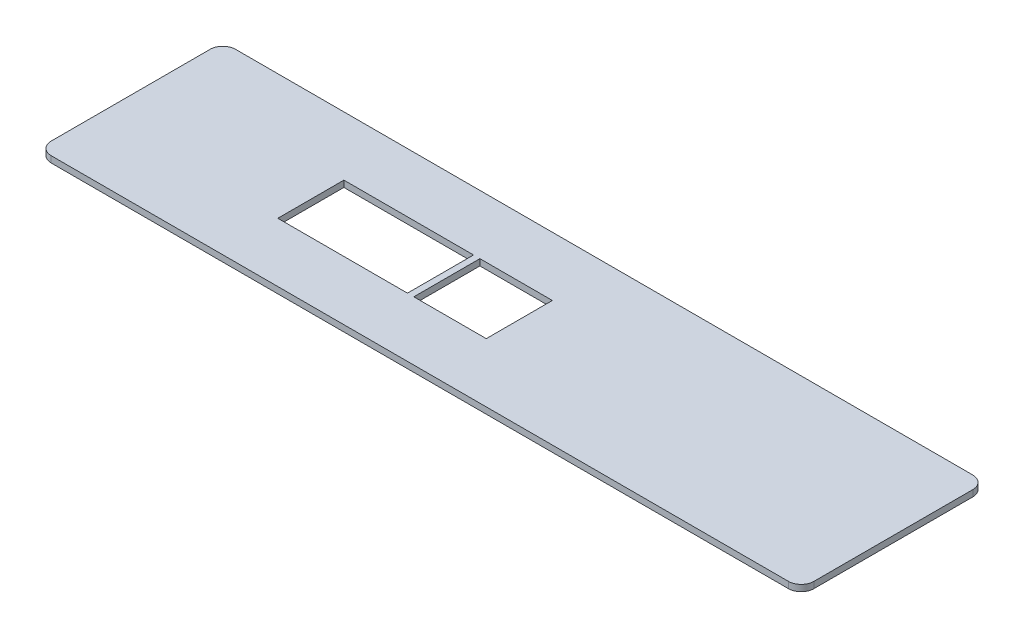
ISO-10303-21;
HEADER;
FILE_DESCRIPTION(('STEP AP214'),'2;1');
FILE_NAME('part.step','',(''),(''),'','','');
FILE_SCHEMA(('AUTOMOTIVE_DESIGN { 1 0 10303 214 1 1 1 1 }'));
ENDSEC;
DATA;
#1=APPLICATION_CONTEXT('core data for automotive mechanical design processes');
#2=APPLICATION_PROTOCOL_DEFINITION('international standard','automotive_design',2000,#1);
#3=PRODUCT_CONTEXT('',#1,'mechanical');
#4=PRODUCT('Part','Part','',(#3));
#5=PRODUCT_RELATED_PRODUCT_CATEGORY('part','',(#4));
#6=PRODUCT_DEFINITION_FORMATION('','',#4);
#7=PRODUCT_DEFINITION_CONTEXT('part definition',#1,'design');
#8=PRODUCT_DEFINITION('design','',#6,#7);
#9=PRODUCT_DEFINITION_SHAPE('','',#8);
#10=(LENGTH_UNIT() NAMED_UNIT(*) SI_UNIT(.MILLI.,.METRE.));
#11=(NAMED_UNIT(*) PLANE_ANGLE_UNIT() SI_UNIT($,.RADIAN.));
#12=(NAMED_UNIT(*) SI_UNIT($,.STERADIAN.) SOLID_ANGLE_UNIT());
#13=UNCERTAINTY_MEASURE_WITH_UNIT(LENGTH_MEASURE(1.E-05),#10,'distance_accuracy_value','');
#14=(GEOMETRIC_REPRESENTATION_CONTEXT(3) GLOBAL_UNCERTAINTY_ASSIGNED_CONTEXT((#13)) GLOBAL_UNIT_ASSIGNED_CONTEXT((#10,
#11,#12)) REPRESENTATION_CONTEXT('',''));
#15=CARTESIAN_POINT('',(0.,0.,0.));
#16=DIRECTION('',(0.,0.,1.));
#17=DIRECTION('',(1.,0.,0.));
#18=AXIS2_PLACEMENT_3D('',#15,#16,#17);
#19=CARTESIAN_POINT('',(118.,1.,-12.5));
#20=DIRECTION('',(0.,-1.,0.));
#21=DIRECTION('',(0.,0.,-1.));
#22=AXIS2_PLACEMENT_3D('',#19,#20,#21);
#23=PLANE('',#22);
#24=DIRECTION('',(0.,0.,1.));
#25=VECTOR('',#24,1.);
#26=CARTESIAN_POINT('',(28.35,1.,-5.2));
#27=LINE('',#26,#25);
#28=CARTESIAN_POINT('',(28.35,1.,-5.2));
#29=VERTEX_POINT('',#28);
#30=CARTESIAN_POINT('',(28.35,1.,5.2));
#31=VERTEX_POINT('',#30);
#32=EDGE_CURVE('E192',#29,#31,#27,.T.);
#33=ORIENTED_EDGE('',*,*,#32,.F.);
#34=DIRECTION('',(-1.,0.,0.));
#35=VECTOR('',#34,1.);
#36=CARTESIAN_POINT('',(28.35,1.,-5.2));
#37=LINE('',#36,#35);
#38=CARTESIAN_POINT('',(48.75,1.,-5.2));
#39=VERTEX_POINT('',#38);
#40=EDGE_CURVE('E200',#39,#29,#37,.T.);
#41=ORIENTED_EDGE('',*,*,#40,.F.);
#42=DIRECTION('',(0.,0.,-1.));
#43=VECTOR('',#42,1.);
#44=CARTESIAN_POINT('',(48.75,1.,-5.2));
#45=LINE('',#44,#43);
#46=CARTESIAN_POINT('',(48.75,1.,5.2));
#47=VERTEX_POINT('',#46);
#48=EDGE_CURVE('E197',#47,#39,#45,.T.);
#49=ORIENTED_EDGE('',*,*,#48,.F.);
#50=DIRECTION('',(1.,0.,0.));
#51=VECTOR('',#50,1.);
#52=CARTESIAN_POINT('',(28.35,1.,5.2));
#53=LINE('',#52,#51);
#54=EDGE_CURVE('E194',#31,#47,#53,.T.);
#55=ORIENTED_EDGE('',*,*,#54,.F.);
#56=EDGE_LOOP('',(#33,#41,#49,#55));
#57=FACE_BOUND('',#56,.T.);
#58=CARTESIAN_POINT('',(118.,1.,-12.5));
#59=DIRECTION('',(0.,1.,0.));
#60=DIRECTION('',(0.,0.,-1.));
#61=AXIS2_PLACEMENT_3D('',#58,#59,#60);
#62=CIRCLE('',#61,2.);
#63=CARTESIAN_POINT('',(120.,1.,-12.5));
#64=VERTEX_POINT('',#63);
#65=CARTESIAN_POINT('',(118.,1.,-14.5));
#66=VERTEX_POINT('',#65);
#67=EDGE_CURVE('E223',#64,#66,#62,.T.);
#68=ORIENTED_EDGE('',*,*,#67,.T.);
#69=DIRECTION('',(-1.,0.,0.));
#70=VECTOR('',#69,1.);
#71=CARTESIAN_POINT('',(118.,1.,-14.5));
#72=LINE('',#71,#70);
#73=CARTESIAN_POINT('',(2.00000000000001,1.,-14.5));
#74=VERTEX_POINT('',#73);
#75=EDGE_CURVE('E226',#66,#74,#72,.T.);
#76=ORIENTED_EDGE('',*,*,#75,.T.);
#77=CARTESIAN_POINT('',(1.99999999999999,1.,-12.5));
#78=DIRECTION('',(0.,1.,0.));
#79=DIRECTION('',(0.,0.,1.));
#80=AXIS2_PLACEMENT_3D('',#77,#78,#79);
#81=CIRCLE('',#80,2.);
#82=CARTESIAN_POINT('',(0.,1.,-12.5));
#83=VERTEX_POINT('',#82);
#84=EDGE_CURVE('E229',#74,#83,#81,.T.);
#85=ORIENTED_EDGE('',*,*,#84,.T.);
#86=DIRECTION('',(0.,0.,1.));
#87=VECTOR('',#86,1.);
#88=CARTESIAN_POINT('',(0.,1.,-12.5));
#89=LINE('',#88,#87);
#90=CARTESIAN_POINT('',(0.,1.,12.5));
#91=VERTEX_POINT('',#90);
#92=EDGE_CURVE('E231',#83,#91,#89,.T.);
#93=ORIENTED_EDGE('',*,*,#92,.T.);
#94=CARTESIAN_POINT('',(2.,1.,12.5));
#95=DIRECTION('',(0.,1.,0.));
#96=DIRECTION('',(0.,0.,-1.));
#97=AXIS2_PLACEMENT_3D('',#94,#95,#96);
#98=CIRCLE('',#97,2.);
#99=CARTESIAN_POINT('',(2.00000000000001,1.,14.5));
#100=VERTEX_POINT('',#99);
#101=EDGE_CURVE('E233',#91,#100,#98,.T.);
#102=ORIENTED_EDGE('',*,*,#101,.T.);
#103=DIRECTION('',(1.,0.,0.));
#104=VECTOR('',#103,1.);
#105=CARTESIAN_POINT('',(2.00000000000001,1.,14.5));
#106=LINE('',#105,#104);
#107=CARTESIAN_POINT('',(118.,1.,14.4999999999999));
#108=VERTEX_POINT('',#107);
#109=EDGE_CURVE('E235',#100,#108,#106,.T.);
#110=ORIENTED_EDGE('',*,*,#109,.T.);
#111=CARTESIAN_POINT('',(118.,1.,12.4999999999999));
#112=DIRECTION('',(0.,1.,0.));
#113=DIRECTION('',(0.,0.,-1.));
#114=AXIS2_PLACEMENT_3D('',#111,#112,#113);
#115=CIRCLE('',#114,2.);
#116=CARTESIAN_POINT('',(120.,1.,12.4999999999999));
#117=VERTEX_POINT('',#116);
#118=EDGE_CURVE('E237',#108,#117,#115,.T.);
#119=ORIENTED_EDGE('',*,*,#118,.T.);
#120=DIRECTION('',(0.,0.,-1.));
#121=VECTOR('',#120,1.);
#122=CARTESIAN_POINT('',(120.,1.,12.4999999999999));
#123=LINE('',#122,#121);
#124=EDGE_CURVE('E239',#117,#64,#123,.T.);
#125=ORIENTED_EDGE('',*,*,#124,.T.);
#126=EDGE_LOOP('',(#68,#76,#85,#93,#102,#110,#119,#125));
#127=FACE_BOUND('',#126,.T.);
#128=DIRECTION('',(0.,0.,1.));
#129=VECTOR('',#128,1.);
#130=CARTESIAN_POINT('',(49.75,1.,-5.2));
#131=LINE('',#130,#129);
#132=CARTESIAN_POINT('',(49.75,1.,-5.2));
#133=VERTEX_POINT('',#132);
#134=CARTESIAN_POINT('',(49.75,1.,5.2));
#135=VERTEX_POINT('',#134);
#136=EDGE_CURVE('E156',#133,#135,#131,.T.);
#137=ORIENTED_EDGE('',*,*,#136,.F.);
#138=DIRECTION('',(-1.,0.,0.));
#139=VECTOR('',#138,1.);
#140=CARTESIAN_POINT('',(49.75,1.,-5.2));
#141=LINE('',#140,#139);
#142=CARTESIAN_POINT('',(61.15,1.,-5.2));
#143=VERTEX_POINT('',#142);
#144=EDGE_CURVE('E178',#143,#133,#141,.T.);
#145=ORIENTED_EDGE('',*,*,#144,.F.);
#146=DIRECTION('',(0.,0.,-1.));
#147=VECTOR('',#146,1.);
#148=CARTESIAN_POINT('',(61.15,1.,-5.2));
#149=LINE('',#148,#147);
#150=CARTESIAN_POINT('',(61.15,1.,5.2));
#151=VERTEX_POINT('',#150);
#152=EDGE_CURVE('E176',#151,#143,#149,.T.);
#153=ORIENTED_EDGE('',*,*,#152,.F.);
#154=DIRECTION('',(1.,0.,0.));
#155=VECTOR('',#154,1.);
#156=CARTESIAN_POINT('',(49.75,1.,5.2));
#157=LINE('',#156,#155);
#158=EDGE_CURVE('E164',#135,#151,#157,.T.);
#159=ORIENTED_EDGE('',*,*,#158,.F.);
#160=EDGE_LOOP('',(#137,#145,#153,#159));
#161=FACE_BOUND('',#160,.T.);
#162=ADVANCED_FACE('F43',(#57,#127,#161),#23,.F.);
#163=CARTESIAN_POINT('',(118.,0.,-12.5));
#164=DIRECTION('',(0.,-1.,0.));
#165=DIRECTION('',(0.,0.,-1.));
#166=AXIS2_PLACEMENT_3D('',#163,#164,#165);
#167=PLANE('',#166);
#168=CARTESIAN_POINT('',(118.,0.,-12.5));
#169=DIRECTION('',(0.,1.,0.));
#170=DIRECTION('',(0.,0.,-1.));
#171=AXIS2_PLACEMENT_3D('',#168,#169,#170);
#172=CIRCLE('',#171,2.);
#173=CARTESIAN_POINT('',(120.,0.,-12.5));
#174=VERTEX_POINT('',#173);
#175=CARTESIAN_POINT('',(118.,0.,-14.5));
#176=VERTEX_POINT('',#175);
#177=EDGE_CURVE('E222',#174,#176,#172,.T.);
#178=ORIENTED_EDGE('',*,*,#177,.F.);
#179=DIRECTION('',(0.,0.,-1.));
#180=VECTOR('',#179,1.);
#181=CARTESIAN_POINT('',(120.,0.,12.4999999999999));
#182=LINE('',#181,#180);
#183=CARTESIAN_POINT('',(120.,0.,12.4999999999999));
#184=VERTEX_POINT('',#183);
#185=EDGE_CURVE('E227',#184,#174,#182,.T.);
#186=ORIENTED_EDGE('',*,*,#185,.F.);
#187=CARTESIAN_POINT('',(118.,0.,12.4999999999999));
#188=DIRECTION('',(0.,1.,0.));
#189=DIRECTION('',(0.,0.,-1.));
#190=AXIS2_PLACEMENT_3D('',#187,#188,#189);
#191=CIRCLE('',#190,2.);
#192=CARTESIAN_POINT('',(118.,0.,14.4999999999999));
#193=VERTEX_POINT('',#192);
#194=EDGE_CURVE('E254',#193,#184,#191,.T.);
#195=ORIENTED_EDGE('',*,*,#194,.F.);
#196=DIRECTION('',(1.,0.,0.));
#197=VECTOR('',#196,1.);
#198=CARTESIAN_POINT('',(2.00000000000001,0.,14.5));
#199=LINE('',#198,#197);
#200=CARTESIAN_POINT('',(2.00000000000001,0.,14.5));
#201=VERTEX_POINT('',#200);
#202=EDGE_CURVE('E252',#201,#193,#199,.T.);
#203=ORIENTED_EDGE('',*,*,#202,.F.);
#204=CARTESIAN_POINT('',(2.,0.,12.5));
#205=DIRECTION('',(0.,1.,0.));
#206=DIRECTION('',(0.,0.,-1.));
#207=AXIS2_PLACEMENT_3D('',#204,#205,#206);
#208=CIRCLE('',#207,2.);
#209=CARTESIAN_POINT('',(0.,0.,12.5));
#210=VERTEX_POINT('',#209);
#211=EDGE_CURVE('E250',#210,#201,#208,.T.);
#212=ORIENTED_EDGE('',*,*,#211,.F.);
#213=DIRECTION('',(0.,0.,1.));
#214=VECTOR('',#213,1.);
#215=CARTESIAN_POINT('',(0.,0.,-12.5));
#216=LINE('',#215,#214);
#217=CARTESIAN_POINT('',(0.,0.,-12.5));
#218=VERTEX_POINT('',#217);
#219=EDGE_CURVE('E248',#218,#210,#216,.T.);
#220=ORIENTED_EDGE('',*,*,#219,.F.);
#221=CARTESIAN_POINT('',(1.99999999999999,0.,-12.5));
#222=DIRECTION('',(0.,1.,0.));
#223=DIRECTION('',(0.,0.,1.));
#224=AXIS2_PLACEMENT_3D('',#221,#222,#223);
#225=CIRCLE('',#224,2.);
#226=CARTESIAN_POINT('',(2.00000000000001,0.,-14.5));
#227=VERTEX_POINT('',#226);
#228=EDGE_CURVE('E246',#227,#218,#225,.T.);
#229=ORIENTED_EDGE('',*,*,#228,.F.);
#230=DIRECTION('',(-1.,0.,0.));
#231=VECTOR('',#230,1.);
#232=CARTESIAN_POINT('',(118.,0.,-14.5));
#233=LINE('',#232,#231);
#234=EDGE_CURVE('E244',#176,#227,#233,.T.);
#235=ORIENTED_EDGE('',*,*,#234,.F.);
#236=EDGE_LOOP('',(#178,#186,#195,#203,#212,#220,#229,#235));
#237=FACE_BOUND('',#236,.T.);
#238=DIRECTION('',(-1.,0.,0.));
#239=VECTOR('',#238,1.);
#240=CARTESIAN_POINT('',(28.35,0.,-5.2));
#241=LINE('',#240,#239);
#242=CARTESIAN_POINT('',(48.75,0.,-5.2));
#243=VERTEX_POINT('',#242);
#244=CARTESIAN_POINT('',(28.35,0.,-5.2));
#245=VERTEX_POINT('',#244);
#246=EDGE_CURVE('E195',#243,#245,#241,.T.);
#247=ORIENTED_EDGE('',*,*,#246,.T.);
#248=DIRECTION('',(0.,0.,1.));
#249=VECTOR('',#248,1.);
#250=CARTESIAN_POINT('',(28.35,0.,-5.2));
#251=LINE('',#250,#249);
#252=CARTESIAN_POINT('',(28.35,0.,5.2));
#253=VERTEX_POINT('',#252);
#254=EDGE_CURVE('E172',#245,#253,#251,.T.);
#255=ORIENTED_EDGE('',*,*,#254,.T.);
#256=DIRECTION('',(1.,0.,0.));
#257=VECTOR('',#256,1.);
#258=CARTESIAN_POINT('',(28.35,0.,5.2));
#259=LINE('',#258,#257);
#260=CARTESIAN_POINT('',(48.75,0.,5.2));
#261=VERTEX_POINT('',#260);
#262=EDGE_CURVE('E205',#253,#261,#259,.T.);
#263=ORIENTED_EDGE('',*,*,#262,.T.);
#264=DIRECTION('',(0.,0.,-1.));
#265=VECTOR('',#264,1.);
#266=CARTESIAN_POINT('',(48.75,0.,-5.2));
#267=LINE('',#266,#265);
#268=EDGE_CURVE('E208',#261,#243,#267,.T.);
#269=ORIENTED_EDGE('',*,*,#268,.T.);
#270=EDGE_LOOP('',(#247,#255,#263,#269));
#271=FACE_BOUND('',#270,.T.);
#272=DIRECTION('',(-1.,0.,0.));
#273=VECTOR('',#272,1.);
#274=CARTESIAN_POINT('',(49.75,0.,-5.2));
#275=LINE('',#274,#273);
#276=CARTESIAN_POINT('',(61.15,0.,-5.2));
#277=VERTEX_POINT('',#276);
#278=CARTESIAN_POINT('',(49.75,0.,-5.2));
#279=VERTEX_POINT('',#278);
#280=EDGE_CURVE('E165',#277,#279,#275,.T.);
#281=ORIENTED_EDGE('',*,*,#280,.T.);
#282=DIRECTION('',(0.,0.,1.));
#283=VECTOR('',#282,1.);
#284=CARTESIAN_POINT('',(49.75,0.,-5.2));
#285=LINE('',#284,#283);
#286=CARTESIAN_POINT('',(49.75,0.,5.2));
#287=VERTEX_POINT('',#286);
#288=EDGE_CURVE('E66',#279,#287,#285,.T.);
#289=ORIENTED_EDGE('',*,*,#288,.T.);
#290=DIRECTION('',(1.,0.,0.));
#291=VECTOR('',#290,1.);
#292=CARTESIAN_POINT('',(49.75,0.,5.2));
#293=LINE('',#292,#291);
#294=CARTESIAN_POINT('',(61.15,0.,5.2));
#295=VERTEX_POINT('',#294);
#296=EDGE_CURVE('E171',#287,#295,#293,.T.);
#297=ORIENTED_EDGE('',*,*,#296,.T.);
#298=DIRECTION('',(0.,0.,-1.));
#299=VECTOR('',#298,1.);
#300=CARTESIAN_POINT('',(61.15,0.,-5.2));
#301=LINE('',#300,#299);
#302=EDGE_CURVE('E184',#295,#277,#301,.T.);
#303=ORIENTED_EDGE('',*,*,#302,.T.);
#304=EDGE_LOOP('',(#281,#289,#297,#303));
#305=FACE_BOUND('',#304,.T.);
#306=ADVANCED_FACE('F284',(#237,#271,#305),#167,.T.);
#307=CARTESIAN_POINT('',(118.,1.,-12.5));
#308=DIRECTION('',(0.,-1.,0.));
#309=DIRECTION('',(0.,0.,-1.));
#310=AXIS2_PLACEMENT_3D('',#307,#308,#309);
#311=CYLINDRICAL_SURFACE('',#310,2.);
#312=ORIENTED_EDGE('',*,*,#177,.T.);
#313=DIRECTION('',(0.,-1.,0.));
#314=VECTOR('',#313,1.);
#315=CARTESIAN_POINT('',(118.,1.,-14.5));
#316=LINE('',#315,#314);
#317=EDGE_CURVE('E11',#66,#176,#316,.T.);
#318=ORIENTED_EDGE('',*,*,#317,.F.);
#319=ORIENTED_EDGE('',*,*,#67,.F.);
#320=DIRECTION('',(0.,-1.,0.));
#321=VECTOR('',#320,1.);
#322=CARTESIAN_POINT('',(120.,1.,-12.5));
#323=LINE('',#322,#321);
#324=EDGE_CURVE('E241',#64,#174,#323,.T.);
#325=ORIENTED_EDGE('',*,*,#324,.T.);
#326=EDGE_LOOP('',(#312,#318,#319,#325));
#327=FACE_BOUND('',#326,.T.);
#328=ADVANCED_FACE('F45',(#327),#311,.T.);
#329=CARTESIAN_POINT('',(118.,1.,-14.5));
#330=DIRECTION('',(0.,0.,1.));
#331=DIRECTION('',(1.,0.,0.));
#332=AXIS2_PLACEMENT_3D('',#329,#330,#331);
#333=PLANE('',#332);
#334=ORIENTED_EDGE('',*,*,#234,.T.);
#335=DIRECTION('',(0.,-1.,0.));
#336=VECTOR('',#335,1.);
#337=CARTESIAN_POINT('',(2.00000000000001,1.,-14.5));
#338=LINE('',#337,#336);
#339=EDGE_CURVE('E51',#74,#227,#338,.T.);
#340=ORIENTED_EDGE('',*,*,#339,.F.);
#341=ORIENTED_EDGE('',*,*,#75,.F.);
#342=ORIENTED_EDGE('',*,*,#317,.T.);
#343=EDGE_LOOP('',(#334,#340,#341,#342));
#344=FACE_BOUND('',#343,.T.);
#345=ADVANCED_FACE('F301',(#344),#333,.F.);
#346=CARTESIAN_POINT('',(1.99999999999999,1.,-12.5));
#347=DIRECTION('',(0.,-1.,0.));
#348=DIRECTION('',(0.,0.,-1.));
#349=AXIS2_PLACEMENT_3D('',#346,#347,#348);
#350=CYLINDRICAL_SURFACE('',#349,2.);
#351=ORIENTED_EDGE('',*,*,#228,.T.);
#352=DIRECTION('',(0.,-1.,0.));
#353=VECTOR('',#352,1.);
#354=CARTESIAN_POINT('',(0.,1.,-12.5));
#355=LINE('',#354,#353);
#356=EDGE_CURVE('E271',#83,#218,#355,.T.);
#357=ORIENTED_EDGE('',*,*,#356,.F.);
#358=ORIENTED_EDGE('',*,*,#84,.F.);
#359=ORIENTED_EDGE('',*,*,#339,.T.);
#360=EDGE_LOOP('',(#351,#357,#358,#359));
#361=FACE_BOUND('',#360,.T.);
#362=ADVANCED_FACE('F278',(#361),#350,.T.);
#363=CARTESIAN_POINT('',(0.,1.,-12.5));
#364=DIRECTION('',(1.,0.,0.));
#365=DIRECTION('',(0.,0.,-1.));
#366=AXIS2_PLACEMENT_3D('',#363,#364,#365);
#367=PLANE('',#366);
#368=ORIENTED_EDGE('',*,*,#219,.T.);
#369=DIRECTION('',(0.,-1.,0.));
#370=VECTOR('',#369,1.);
#371=CARTESIAN_POINT('',(0.,1.,12.5));
#372=LINE('',#371,#370);
#373=EDGE_CURVE('E268',#91,#210,#372,.T.);
#374=ORIENTED_EDGE('',*,*,#373,.F.);
#375=ORIENTED_EDGE('',*,*,#92,.F.);
#376=ORIENTED_EDGE('',*,*,#356,.T.);
#377=EDGE_LOOP('',(#368,#374,#375,#376));
#378=FACE_BOUND('',#377,.T.);
#379=ADVANCED_FACE('F290',(#378),#367,.F.);
#380=CARTESIAN_POINT('',(2.,1.,12.5));
#381=DIRECTION('',(0.,-1.,0.));
#382=DIRECTION('',(0.,0.,-1.));
#383=AXIS2_PLACEMENT_3D('',#380,#381,#382);
#384=CYLINDRICAL_SURFACE('',#383,2.);
#385=ORIENTED_EDGE('',*,*,#211,.T.);
#386=DIRECTION('',(0.,-1.,0.));
#387=VECTOR('',#386,1.);
#388=CARTESIAN_POINT('',(2.00000000000001,1.,14.5));
#389=LINE('',#388,#387);
#390=EDGE_CURVE('E265',#100,#201,#389,.T.);
#391=ORIENTED_EDGE('',*,*,#390,.F.);
#392=ORIENTED_EDGE('',*,*,#101,.F.);
#393=ORIENTED_EDGE('',*,*,#373,.T.);
#394=EDGE_LOOP('',(#385,#391,#392,#393));
#395=FACE_BOUND('',#394,.T.);
#396=ADVANCED_FACE('F294',(#395),#384,.T.);
#397=CARTESIAN_POINT('',(2.00000000000001,1.,14.5));
#398=DIRECTION('',(0.,0.,-1.));
#399=DIRECTION('',(-1.,0.,0.));
#400=AXIS2_PLACEMENT_3D('',#397,#398,#399);
#401=PLANE('',#400);
#402=ORIENTED_EDGE('',*,*,#202,.T.);
#403=DIRECTION('',(0.,-1.,0.));
#404=VECTOR('',#403,1.);
#405=CARTESIAN_POINT('',(118.,1.,14.4999999999999));
#406=LINE('',#405,#404);
#407=EDGE_CURVE('E262',#108,#193,#406,.T.);
#408=ORIENTED_EDGE('',*,*,#407,.F.);
#409=ORIENTED_EDGE('',*,*,#109,.F.);
#410=ORIENTED_EDGE('',*,*,#390,.T.);
#411=EDGE_LOOP('',(#402,#408,#409,#410));
#412=FACE_BOUND('',#411,.T.);
#413=ADVANCED_FACE('F314',(#412),#401,.F.);
#414=CARTESIAN_POINT('',(118.,1.,12.4999999999999));
#415=DIRECTION('',(0.,-1.,0.));
#416=DIRECTION('',(0.,0.,-1.));
#417=AXIS2_PLACEMENT_3D('',#414,#415,#416);
#418=CYLINDRICAL_SURFACE('',#417,2.);
#419=ORIENTED_EDGE('',*,*,#194,.T.);
#420=DIRECTION('',(0.,-1.,0.));
#421=VECTOR('',#420,1.);
#422=CARTESIAN_POINT('',(120.,1.,12.4999999999999));
#423=LINE('',#422,#421);
#424=EDGE_CURVE('E259',#117,#184,#423,.T.);
#425=ORIENTED_EDGE('',*,*,#424,.F.);
#426=ORIENTED_EDGE('',*,*,#118,.F.);
#427=ORIENTED_EDGE('',*,*,#407,.T.);
#428=EDGE_LOOP('',(#419,#425,#426,#427));
#429=FACE_BOUND('',#428,.T.);
#430=ADVANCED_FACE('F312',(#429),#418,.T.);
#431=CARTESIAN_POINT('',(120.,1.,12.4999999999999));
#432=DIRECTION('',(-1.,0.,0.));
#433=DIRECTION('',(0.,0.,1.));
#434=AXIS2_PLACEMENT_3D('',#431,#432,#433);
#435=PLANE('',#434);
#436=ORIENTED_EDGE('',*,*,#185,.T.);
#437=ORIENTED_EDGE('',*,*,#324,.F.);
#438=ORIENTED_EDGE('',*,*,#124,.F.);
#439=ORIENTED_EDGE('',*,*,#424,.T.);
#440=EDGE_LOOP('',(#436,#437,#438,#439));
#441=FACE_BOUND('',#440,.T.);
#442=ADVANCED_FACE('F307',(#441),#435,.F.);
#443=CARTESIAN_POINT('',(28.35,1.,-5.2));
#444=DIRECTION('',(1.,0.,0.));
#445=DIRECTION('',(0.,0.,-1.));
#446=AXIS2_PLACEMENT_3D('',#443,#444,#445);
#447=PLANE('',#446);
#448=ORIENTED_EDGE('',*,*,#254,.F.);
#449=DIRECTION('',(0.,-1.,0.));
#450=VECTOR('',#449,1.);
#451=CARTESIAN_POINT('',(28.35,1.,-5.2));
#452=LINE('',#451,#450);
#453=EDGE_CURVE('E202',#29,#245,#452,.T.);
#454=ORIENTED_EDGE('',*,*,#453,.F.);
#455=ORIENTED_EDGE('',*,*,#32,.T.);
#456=DIRECTION('',(0.,-1.,0.));
#457=VECTOR('',#456,1.);
#458=CARTESIAN_POINT('',(28.35,1.,5.2));
#459=LINE('',#458,#457);
#460=EDGE_CURVE('E219',#31,#253,#459,.T.);
#461=ORIENTED_EDGE('',*,*,#460,.T.);
#462=EDGE_LOOP('',(#448,#454,#455,#461));
#463=FACE_BOUND('',#462,.T.);
#464=ADVANCED_FACE('F332',(#463),#447,.T.);
#465=CARTESIAN_POINT('',(28.35,1.,5.2));
#466=DIRECTION('',(0.,0.,-1.));
#467=DIRECTION('',(-1.,0.,0.));
#468=AXIS2_PLACEMENT_3D('',#465,#466,#467);
#469=PLANE('',#468);
#470=ORIENTED_EDGE('',*,*,#262,.F.);
#471=ORIENTED_EDGE('',*,*,#460,.F.);
#472=ORIENTED_EDGE('',*,*,#54,.T.);
#473=DIRECTION('',(0.,-1.,0.));
#474=VECTOR('',#473,1.);
#475=CARTESIAN_POINT('',(48.75,1.,5.2));
#476=LINE('',#475,#474);
#477=EDGE_CURVE('E217',#47,#261,#476,.T.);
#478=ORIENTED_EDGE('',*,*,#477,.T.);
#479=EDGE_LOOP('',(#470,#471,#472,#478));
#480=FACE_BOUND('',#479,.T.);
#481=ADVANCED_FACE('F339',(#480),#469,.T.);
#482=CARTESIAN_POINT('',(48.75,1.,-5.2));
#483=DIRECTION('',(-1.,0.,0.));
#484=DIRECTION('',(0.,0.,1.));
#485=AXIS2_PLACEMENT_3D('',#482,#483,#484);
#486=PLANE('',#485);
#487=ORIENTED_EDGE('',*,*,#268,.F.);
#488=ORIENTED_EDGE('',*,*,#477,.F.);
#489=ORIENTED_EDGE('',*,*,#48,.T.);
#490=DIRECTION('',(0.,-1.,0.));
#491=VECTOR('',#490,1.);
#492=CARTESIAN_POINT('',(48.75,1.,-5.2));
#493=LINE('',#492,#491);
#494=EDGE_CURVE('E215',#39,#243,#493,.T.);
#495=ORIENTED_EDGE('',*,*,#494,.T.);
#496=EDGE_LOOP('',(#487,#488,#489,#495));
#497=FACE_BOUND('',#496,.T.);
#498=ADVANCED_FACE('F344',(#497),#486,.T.);
#499=CARTESIAN_POINT('',(28.35,1.,-5.2));
#500=DIRECTION('',(0.,0.,1.));
#501=DIRECTION('',(1.,0.,0.));
#502=AXIS2_PLACEMENT_3D('',#499,#500,#501);
#503=PLANE('',#502);
#504=ORIENTED_EDGE('',*,*,#246,.F.);
#505=ORIENTED_EDGE('',*,*,#494,.F.);
#506=ORIENTED_EDGE('',*,*,#40,.T.);
#507=ORIENTED_EDGE('',*,*,#453,.T.);
#508=EDGE_LOOP('',(#504,#505,#506,#507));
#509=FACE_BOUND('',#508,.T.);
#510=ADVANCED_FACE('F350',(#509),#503,.T.);
#511=CARTESIAN_POINT('',(49.75,1.,-5.2));
#512=DIRECTION('',(1.,0.,0.));
#513=DIRECTION('',(0.,0.,-1.));
#514=AXIS2_PLACEMENT_3D('',#511,#512,#513);
#515=PLANE('',#514);
#516=ORIENTED_EDGE('',*,*,#288,.F.);
#517=DIRECTION('',(0.,-1.,0.));
#518=VECTOR('',#517,1.);
#519=CARTESIAN_POINT('',(49.75,1.,-5.2));
#520=LINE('',#519,#518);
#521=EDGE_CURVE('E160',#133,#279,#520,.T.);
#522=ORIENTED_EDGE('',*,*,#521,.F.);
#523=ORIENTED_EDGE('',*,*,#136,.T.);
#524=DIRECTION('',(0.,-1.,0.));
#525=VECTOR('',#524,1.);
#526=CARTESIAN_POINT('',(49.75,1.,5.2));
#527=LINE('',#526,#525);
#528=EDGE_CURVE('E159',#135,#287,#527,.T.);
#529=ORIENTED_EDGE('',*,*,#528,.T.);
#530=EDGE_LOOP('',(#516,#522,#523,#529));
#531=FACE_BOUND('',#530,.T.);
#532=ADVANCED_FACE('F158',(#531),#515,.T.);
#533=CARTESIAN_POINT('',(49.75,1.,5.2));
#534=DIRECTION('',(0.,0.,-1.));
#535=DIRECTION('',(-1.,0.,0.));
#536=AXIS2_PLACEMENT_3D('',#533,#534,#535);
#537=PLANE('',#536);
#538=ORIENTED_EDGE('',*,*,#296,.F.);
#539=ORIENTED_EDGE('',*,*,#528,.F.);
#540=ORIENTED_EDGE('',*,*,#158,.T.);
#541=DIRECTION('',(0.,-1.,0.));
#542=VECTOR('',#541,1.);
#543=CARTESIAN_POINT('',(61.15,1.,5.2));
#544=LINE('',#543,#542);
#545=EDGE_CURVE('E173',#151,#295,#544,.T.);
#546=ORIENTED_EDGE('',*,*,#545,.T.);
#547=EDGE_LOOP('',(#538,#539,#540,#546));
#548=FACE_BOUND('',#547,.T.);
#549=ADVANCED_FACE('F168',(#548),#537,.T.);
#550=CARTESIAN_POINT('',(61.15,1.,-5.2));
#551=DIRECTION('',(-1.,0.,0.));
#552=DIRECTION('',(0.,0.,1.));
#553=AXIS2_PLACEMENT_3D('',#550,#551,#552);
#554=PLANE('',#553);
#555=ORIENTED_EDGE('',*,*,#302,.F.);
#556=ORIENTED_EDGE('',*,*,#545,.F.);
#557=ORIENTED_EDGE('',*,*,#152,.T.);
#558=DIRECTION('',(0.,-1.,0.));
#559=VECTOR('',#558,1.);
#560=CARTESIAN_POINT('',(61.15,1.,-5.2));
#561=LINE('',#560,#559);
#562=EDGE_CURVE('E58',#143,#277,#561,.T.);
#563=ORIENTED_EDGE('',*,*,#562,.T.);
#564=EDGE_LOOP('',(#555,#556,#557,#563));
#565=FACE_BOUND('',#564,.T.);
#566=ADVANCED_FACE('F369',(#565),#554,.T.);
#567=CARTESIAN_POINT('',(49.75,1.,-5.2));
#568=DIRECTION('',(0.,0.,1.));
#569=DIRECTION('',(1.,0.,0.));
#570=AXIS2_PLACEMENT_3D('',#567,#568,#569);
#571=PLANE('',#570);
#572=ORIENTED_EDGE('',*,*,#280,.F.);
#573=ORIENTED_EDGE('',*,*,#562,.F.);
#574=ORIENTED_EDGE('',*,*,#144,.T.);
#575=ORIENTED_EDGE('',*,*,#521,.T.);
#576=EDGE_LOOP('',(#572,#573,#574,#575));
#577=FACE_BOUND('',#576,.T.);
#578=ADVANCED_FACE('F372',(#577),#571,.T.);
#579=CLOSED_SHELL('',(#162,#306,#328,#345,#362,#379,#396,#413,#430,#442,#464,#481,#498,#510,
#532,#549,#566,#578));
#580=MANIFOLD_SOLID_BREP('B2',#579);
#581=ADVANCED_BREP_SHAPE_REPRESENTATION('',(#18,#580),#14);
#582=SHAPE_DEFINITION_REPRESENTATION(#9,#581);
ENDSEC;
END-ISO-10303-21;
